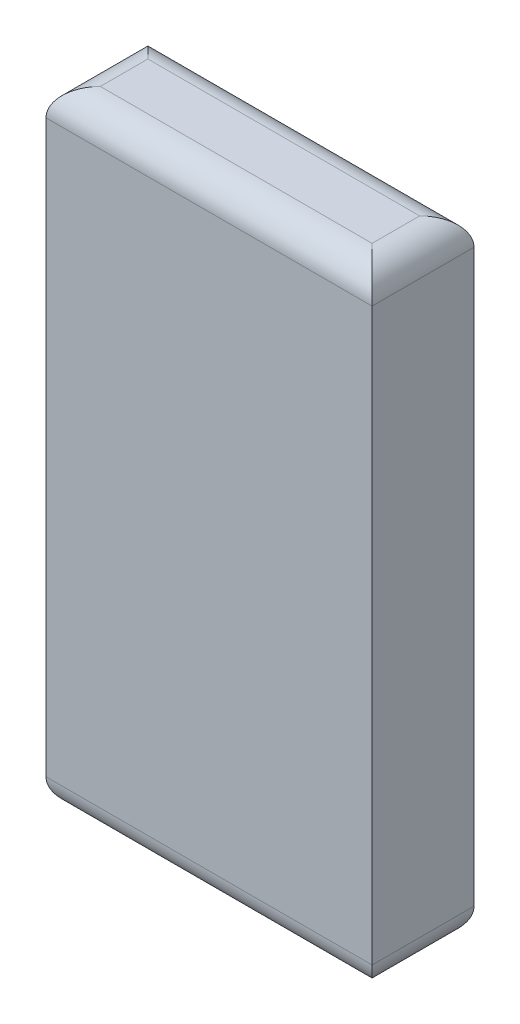
ISO-10303-21;
HEADER;
FILE_DESCRIPTION(('STEP AP214'),'2;1');
FILE_NAME('part.step','',(''),(''),'','','');
FILE_SCHEMA(('AUTOMOTIVE_DESIGN { 1 0 10303 214 1 1 1 1 }'));
ENDSEC;
DATA;
#1=APPLICATION_CONTEXT('core data for automotive mechanical design processes');
#2=APPLICATION_PROTOCOL_DEFINITION('international standard','automotive_design',2000,#1);
#3=PRODUCT_CONTEXT('',#1,'mechanical');
#4=PRODUCT('Part','Part','',(#3));
#5=PRODUCT_RELATED_PRODUCT_CATEGORY('part','',(#4));
#6=PRODUCT_DEFINITION_FORMATION('','',#4);
#7=PRODUCT_DEFINITION_CONTEXT('part definition',#1,'design');
#8=PRODUCT_DEFINITION('design','',#6,#7);
#9=PRODUCT_DEFINITION_SHAPE('','',#8);
#10=(LENGTH_UNIT() NAMED_UNIT(*) SI_UNIT(.MILLI.,.METRE.));
#11=(NAMED_UNIT(*) PLANE_ANGLE_UNIT() SI_UNIT($,.RADIAN.));
#12=(NAMED_UNIT(*) SI_UNIT($,.STERADIAN.) SOLID_ANGLE_UNIT());
#13=UNCERTAINTY_MEASURE_WITH_UNIT(LENGTH_MEASURE(1.E-05),#10,'distance_accuracy_value','');
#14=(GEOMETRIC_REPRESENTATION_CONTEXT(3) GLOBAL_UNCERTAINTY_ASSIGNED_CONTEXT((#13)) GLOBAL_UNIT_ASSIGNED_CONTEXT((#10,
#11,#12)) REPRESENTATION_CONTEXT('',''));
#15=CARTESIAN_POINT('',(0.,0.,0.));
#16=DIRECTION('',(0.,0.,1.));
#17=DIRECTION('',(1.,0.,0.));
#18=AXIS2_PLACEMENT_3D('',#15,#16,#17);
#19=CARTESIAN_POINT('',(0.,0.,9.525));
#20=DIRECTION('',(1.,0.,0.));
#21=DIRECTION('',(0.,0.,-1.));
#22=AXIS2_PLACEMENT_3D('',#19,#20,#21);
#23=PLANE('',#22);
#24=DIRECTION('',(0.,-1.,0.));
#25=VECTOR('',#24,1.);
#26=CARTESIAN_POINT('',(0.,0.,0.));
#27=LINE('',#26,#25);
#28=CARTESIAN_POINT('',(0.,55.88,0.));
#29=VERTEX_POINT('',#28);
#30=CARTESIAN_POINT('',(0.,2.54,0.));
#31=VERTEX_POINT('',#30);
#32=EDGE_CURVE('E184',#29,#31,#27,.T.);
#33=ORIENTED_EDGE('',*,*,#32,.T.);
#34=DIRECTION('',(0.,0.,-1.));
#35=VECTOR('',#34,1.);
#36=CARTESIAN_POINT('',(0.,2.54,9.525));
#37=LINE('',#36,#35);
#38=CARTESIAN_POINT('',(0.,2.54,9.525));
#39=VERTEX_POINT('',#38);
#40=EDGE_CURVE('E118',#31,#39,#37,.F.);
#41=ORIENTED_EDGE('',*,*,#40,.T.);
#42=DIRECTION('',(0.,-1.,0.));
#43=VECTOR('',#42,1.);
#44=CARTESIAN_POINT('',(0.,0.,9.525));
#45=LINE('',#44,#43);
#46=CARTESIAN_POINT('',(0.,55.88,9.525));
#47=VERTEX_POINT('',#46);
#48=EDGE_CURVE('E209',#47,#39,#45,.T.);
#49=ORIENTED_EDGE('',*,*,#48,.F.);
#50=DIRECTION('',(0.,0.,-1.));
#51=VECTOR('',#50,1.);
#52=CARTESIAN_POINT('',(0.,55.88,9.525));
#53=LINE('',#52,#51);
#54=EDGE_CURVE('E140',#47,#29,#53,.T.);
#55=ORIENTED_EDGE('',*,*,#54,.T.);
#56=EDGE_LOOP('',(#33,#41,#49,#55));
#57=FACE_BOUND('',#56,.T.);
#58=ADVANCED_FACE('F45',(#57),#23,.F.);
#59=CARTESIAN_POINT('',(0.,0.,9.525));
#60=DIRECTION('',(0.,1.,0.));
#61=DIRECTION('',(0.,0.,1.));
#62=AXIS2_PLACEMENT_3D('',#59,#60,#61);
#63=PLANE('',#62);
#64=DIRECTION('',(1.,0.,0.));
#65=VECTOR('',#64,1.);
#66=CARTESIAN_POINT('',(0.,0.,6.985));
#67=LINE('',#66,#65);
#68=CARTESIAN_POINT('',(27.94,0.,6.985));
#69=VERTEX_POINT('',#68);
#70=CARTESIAN_POINT('',(2.54,0.,6.985));
#71=VERTEX_POINT('',#70);
#72=EDGE_CURVE('E137',#69,#71,#67,.F.);
#73=ORIENTED_EDGE('',*,*,#72,.T.);
#74=DIRECTION('',(0.,0.,-1.));
#75=VECTOR('',#74,1.);
#76=CARTESIAN_POINT('',(2.54,0.,9.525));
#77=LINE('',#76,#75);
#78=CARTESIAN_POINT('',(2.54,0.,2.54));
#79=VERTEX_POINT('',#78);
#80=EDGE_CURVE('E116',#71,#79,#77,.T.);
#81=ORIENTED_EDGE('',*,*,#80,.T.);
#82=DIRECTION('',(1.,0.,0.));
#83=VECTOR('',#82,1.);
#84=CARTESIAN_POINT('',(30.48,0.,2.54));
#85=LINE('',#84,#83);
#86=CARTESIAN_POINT('',(27.94,0.,2.54));
#87=VERTEX_POINT('',#86);
#88=EDGE_CURVE('E125',#79,#87,#85,.T.);
#89=ORIENTED_EDGE('',*,*,#88,.T.);
#90=DIRECTION('',(0.,0.,-1.));
#91=VECTOR('',#90,1.);
#92=CARTESIAN_POINT('',(27.94,0.,9.525));
#93=LINE('',#92,#91);
#94=EDGE_CURVE('E132',#87,#69,#93,.F.);
#95=ORIENTED_EDGE('',*,*,#94,.T.);
#96=EDGE_LOOP('',(#73,#81,#89,#95));
#97=FACE_BOUND('',#96,.T.);
#98=ADVANCED_FACE('F135',(#97),#63,.F.);
#99=CARTESIAN_POINT('',(30.48,0.,9.525));
#100=DIRECTION('',(-1.,0.,0.));
#101=DIRECTION('',(0.,0.,1.));
#102=AXIS2_PLACEMENT_3D('',#99,#100,#101);
#103=PLANE('',#102);
#104=DIRECTION('',(0.,1.,0.));
#105=VECTOR('',#104,1.);
#106=CARTESIAN_POINT('',(30.48,0.,9.525));
#107=LINE('',#106,#105);
#108=CARTESIAN_POINT('',(30.48,2.54,9.525));
#109=VERTEX_POINT('',#108);
#110=CARTESIAN_POINT('',(30.48,55.88,9.525));
#111=VERTEX_POINT('',#110);
#112=EDGE_CURVE('E133',#109,#111,#107,.T.);
#113=ORIENTED_EDGE('',*,*,#112,.F.);
#114=DIRECTION('',(0.,0.,-1.));
#115=VECTOR('',#114,1.);
#116=CARTESIAN_POINT('',(30.48,2.54,9.525));
#117=LINE('',#116,#115);
#118=CARTESIAN_POINT('',(30.48,2.54,0.));
#119=VERTEX_POINT('',#118);
#120=EDGE_CURVE('E160',#109,#119,#117,.T.);
#121=ORIENTED_EDGE('',*,*,#120,.T.);
#122=DIRECTION('',(0.,1.,0.));
#123=VECTOR('',#122,1.);
#124=CARTESIAN_POINT('',(30.48,0.,0.));
#125=LINE('',#124,#123);
#126=CARTESIAN_POINT('',(30.48,55.88,0.));
#127=VERTEX_POINT('',#126);
#128=EDGE_CURVE('E215',#119,#127,#125,.T.);
#129=ORIENTED_EDGE('',*,*,#128,.T.);
#130=DIRECTION('',(0.,0.,-1.));
#131=VECTOR('',#130,1.);
#132=CARTESIAN_POINT('',(30.48,55.88,9.525));
#133=LINE('',#132,#131);
#134=EDGE_CURVE('E156',#127,#111,#133,.F.);
#135=ORIENTED_EDGE('',*,*,#134,.T.);
#136=EDGE_LOOP('',(#113,#121,#129,#135));
#137=FACE_BOUND('',#136,.T.);
#138=ADVANCED_FACE('F236',(#137),#103,.F.);
#139=CARTESIAN_POINT('',(0.,58.42,9.525));
#140=DIRECTION('',(0.,-1.,0.));
#141=DIRECTION('',(0.,0.,-1.));
#142=AXIS2_PLACEMENT_3D('',#139,#140,#141);
#143=PLANE('',#142);
#144=DIRECTION('',(-1.,0.,0.));
#145=VECTOR('',#144,1.);
#146=CARTESIAN_POINT('',(0.,58.42,6.985));
#147=LINE('',#146,#145);
#148=CARTESIAN_POINT('',(2.54,58.42,6.985));
#149=VERTEX_POINT('',#148);
#150=CARTESIAN_POINT('',(27.94,58.42,6.985));
#151=VERTEX_POINT('',#150);
#152=EDGE_CURVE('E55',#149,#151,#147,.F.);
#153=ORIENTED_EDGE('',*,*,#152,.T.);
#154=DIRECTION('',(0.,0.,-1.));
#155=VECTOR('',#154,1.);
#156=CARTESIAN_POINT('',(27.94,58.42,9.525));
#157=LINE('',#156,#155);
#158=CARTESIAN_POINT('',(27.94,58.42,2.54));
#159=VERTEX_POINT('',#158);
#160=EDGE_CURVE('E11',#151,#159,#157,.T.);
#161=ORIENTED_EDGE('',*,*,#160,.T.);
#162=DIRECTION('',(-1.,0.,0.));
#163=VECTOR('',#162,1.);
#164=CARTESIAN_POINT('',(0.,58.42,2.54));
#165=LINE('',#164,#163);
#166=CARTESIAN_POINT('',(2.54,58.42,2.54));
#167=VERTEX_POINT('',#166);
#168=EDGE_CURVE('E169',#159,#167,#165,.T.);
#169=ORIENTED_EDGE('',*,*,#168,.T.);
#170=DIRECTION('',(0.,0.,-1.));
#171=VECTOR('',#170,1.);
#172=CARTESIAN_POINT('',(2.54,58.42,9.525));
#173=LINE('',#172,#171);
#174=EDGE_CURVE('E66',#167,#149,#173,.F.);
#175=ORIENTED_EDGE('',*,*,#174,.T.);
#176=EDGE_LOOP('',(#153,#161,#169,#175));
#177=FACE_BOUND('',#176,.T.);
#178=ADVANCED_FACE('F243',(#177),#143,.F.);
#179=CARTESIAN_POINT('',(0.,0.,9.525));
#180=DIRECTION('',(0.,0.,-1.));
#181=DIRECTION('',(-1.,0.,0.));
#182=AXIS2_PLACEMENT_3D('',#179,#180,#181);
#183=PLANE('',#182);
#184=ORIENTED_EDGE('',*,*,#48,.T.);
#185=DIRECTION('',(1.,0.,0.));
#186=VECTOR('',#185,1.);
#187=CARTESIAN_POINT('',(0.,2.54,9.525));
#188=LINE('',#187,#186);
#189=EDGE_CURVE('E153',#39,#109,#188,.T.);
#190=ORIENTED_EDGE('',*,*,#189,.T.);
#191=ORIENTED_EDGE('',*,*,#112,.T.);
#192=DIRECTION('',(-1.,0.,0.));
#193=VECTOR('',#192,1.);
#194=CARTESIAN_POINT('',(0.,55.88,9.525));
#195=LINE('',#194,#193);
#196=EDGE_CURVE('E150',#111,#47,#195,.T.);
#197=ORIENTED_EDGE('',*,*,#196,.T.);
#198=EDGE_LOOP('',(#184,#190,#191,#197));
#199=FACE_BOUND('',#198,.T.);
#200=ADVANCED_FACE('F232',(#199),#183,.F.);
#201=CARTESIAN_POINT('',(0.,0.,0.));
#202=DIRECTION('',(0.,0.,-1.));
#203=DIRECTION('',(-1.,0.,0.));
#204=AXIS2_PLACEMENT_3D('',#201,#202,#203);
#205=PLANE('',#204);
#206=ORIENTED_EDGE('',*,*,#128,.F.);
#207=DIRECTION('',(1.,0.,0.));
#208=VECTOR('',#207,1.);
#209=CARTESIAN_POINT('',(0.,2.54,0.));
#210=LINE('',#209,#208);
#211=EDGE_CURVE('E166',#119,#31,#210,.F.);
#212=ORIENTED_EDGE('',*,*,#211,.T.);
#213=ORIENTED_EDGE('',*,*,#32,.F.);
#214=DIRECTION('',(-1.,0.,0.));
#215=VECTOR('',#214,1.);
#216=CARTESIAN_POINT('',(30.48,55.88,0.));
#217=LINE('',#216,#215);
#218=EDGE_CURVE('E163',#29,#127,#217,.F.);
#219=ORIENTED_EDGE('',*,*,#218,.T.);
#220=EDGE_LOOP('',(#206,#212,#213,#219));
#221=FACE_BOUND('',#220,.T.);
#222=ADVANCED_FACE('F212',(#221),#205,.T.);
#223=CARTESIAN_POINT('',(27.94,2.54,9.525));
#224=DIRECTION('',(0.,0.,-1.));
#225=DIRECTION('',(-1.,0.,0.));
#226=AXIS2_PLACEMENT_3D('',#223,#224,#225);
#227=CYLINDRICAL_SURFACE('',#226,2.54);
#228=CARTESIAN_POINT('',(27.94,2.54,2.54));
#229=DIRECTION('',(-0.707106781186547,0.,-0.707106781186547));
#230=DIRECTION('',(-0.707106781186547,0.,0.707106781186547));
#231=AXIS2_PLACEMENT_3D('',#228,#229,#230);
#232=ELLIPSE('',#231,3.59210244842766,2.54);
#233=EDGE_CURVE('E128',#119,#87,#232,.T.);
#234=ORIENTED_EDGE('',*,*,#233,.F.);
#235=ORIENTED_EDGE('',*,*,#120,.F.);
#236=CARTESIAN_POINT('',(27.94,2.54,6.985));
#237=DIRECTION('',(0.707106781186547,0.,-0.707106781186547));
#238=DIRECTION('',(-0.707106781186547,0.,-0.707106781186547));
#239=AXIS2_PLACEMENT_3D('',#236,#237,#238);
#240=ELLIPSE('',#239,3.59210244842766,2.54);
#241=EDGE_CURVE('E180',#69,#109,#240,.F.);
#242=ORIENTED_EDGE('',*,*,#241,.F.);
#243=ORIENTED_EDGE('',*,*,#94,.F.);
#244=EDGE_LOOP('',(#234,#235,#242,#243));
#245=FACE_BOUND('',#244,.T.);
#246=ADVANCED_FACE('F225',(#245),#227,.T.);
#247=CARTESIAN_POINT('',(0.,2.54,6.985));
#248=DIRECTION('',(1.,0.,0.));
#249=DIRECTION('',(0.,0.,-1.));
#250=AXIS2_PLACEMENT_3D('',#247,#248,#249);
#251=CYLINDRICAL_SURFACE('',#250,2.54);
#252=ORIENTED_EDGE('',*,*,#241,.T.);
#253=ORIENTED_EDGE('',*,*,#189,.F.);
#254=CARTESIAN_POINT('',(2.54,2.54,6.985));
#255=DIRECTION('',(0.707106781186547,0.,0.707106781186547));
#256=DIRECTION('',(0.707106781186547,0.,-0.707106781186547));
#257=AXIS2_PLACEMENT_3D('',#254,#255,#256);
#258=ELLIPSE('',#257,3.59210244842766,2.54);
#259=EDGE_CURVE('E122',#71,#39,#258,.F.);
#260=ORIENTED_EDGE('',*,*,#259,.F.);
#261=ORIENTED_EDGE('',*,*,#72,.F.);
#262=EDGE_LOOP('',(#252,#253,#260,#261));
#263=FACE_BOUND('',#262,.T.);
#264=ADVANCED_FACE('F228',(#263),#251,.T.);
#265=CARTESIAN_POINT('',(0.,2.54,2.54));
#266=DIRECTION('',(-1.,0.,0.));
#267=DIRECTION('',(0.,0.,1.));
#268=AXIS2_PLACEMENT_3D('',#265,#266,#267);
#269=CYLINDRICAL_SURFACE('',#268,2.54);
#270=ORIENTED_EDGE('',*,*,#233,.T.);
#271=ORIENTED_EDGE('',*,*,#88,.F.);
#272=CARTESIAN_POINT('',(2.54,2.54,2.54));
#273=DIRECTION('',(-0.707106781186547,0.,0.707106781186547));
#274=DIRECTION('',(-0.707106781186547,0.,-0.707106781186547));
#275=AXIS2_PLACEMENT_3D('',#272,#273,#274);
#276=ELLIPSE('',#275,3.59210244842766,2.54);
#277=EDGE_CURVE('E112',#31,#79,#276,.T.);
#278=ORIENTED_EDGE('',*,*,#277,.F.);
#279=ORIENTED_EDGE('',*,*,#211,.F.);
#280=EDGE_LOOP('',(#270,#271,#278,#279));
#281=FACE_BOUND('',#280,.T.);
#282=ADVANCED_FACE('F126',(#281),#269,.T.);
#283=CARTESIAN_POINT('',(2.54,2.54,9.525));
#284=DIRECTION('',(0.,0.,-1.));
#285=DIRECTION('',(-1.,0.,0.));
#286=AXIS2_PLACEMENT_3D('',#283,#284,#285);
#287=CYLINDRICAL_SURFACE('',#286,2.54);
#288=ORIENTED_EDGE('',*,*,#259,.T.);
#289=ORIENTED_EDGE('',*,*,#40,.F.);
#290=ORIENTED_EDGE('',*,*,#277,.T.);
#291=ORIENTED_EDGE('',*,*,#80,.F.);
#292=EDGE_LOOP('',(#288,#289,#290,#291));
#293=FACE_BOUND('',#292,.T.);
#294=ADVANCED_FACE('F114',(#293),#287,.T.);
#295=CARTESIAN_POINT('',(2.54,55.88,9.525));
#296=DIRECTION('',(0.,0.,-1.));
#297=DIRECTION('',(-1.,0.,0.));
#298=AXIS2_PLACEMENT_3D('',#295,#296,#297);
#299=CYLINDRICAL_SURFACE('',#298,2.54);
#300=CARTESIAN_POINT('',(2.54,55.88,2.54));
#301=DIRECTION('',(0.707106781186547,0.,-0.707106781186547));
#302=DIRECTION('',(0.707106781186547,0.,0.707106781186547));
#303=AXIS2_PLACEMENT_3D('',#300,#301,#302);
#304=ELLIPSE('',#303,3.59210244842766,2.54);
#305=EDGE_CURVE('E190',#29,#167,#304,.T.);
#306=ORIENTED_EDGE('',*,*,#305,.F.);
#307=ORIENTED_EDGE('',*,*,#54,.F.);
#308=CARTESIAN_POINT('',(2.54,55.88,6.985));
#309=DIRECTION('',(-0.707106781186547,0.,-0.707106781186547));
#310=DIRECTION('',(0.707106781186547,0.,-0.707106781186547));
#311=AXIS2_PLACEMENT_3D('',#308,#309,#310);
#312=ELLIPSE('',#311,3.59210244842766,2.54);
#313=EDGE_CURVE('E49',#149,#47,#312,.F.);
#314=ORIENTED_EDGE('',*,*,#313,.F.);
#315=ORIENTED_EDGE('',*,*,#174,.F.);
#316=EDGE_LOOP('',(#306,#307,#314,#315));
#317=FACE_BOUND('',#316,.T.);
#318=ADVANCED_FACE('F47',(#317),#299,.T.);
#319=CARTESIAN_POINT('',(0.,55.88,6.985));
#320=DIRECTION('',(-1.,0.,0.));
#321=DIRECTION('',(0.,0.,1.));
#322=AXIS2_PLACEMENT_3D('',#319,#320,#321);
#323=CYLINDRICAL_SURFACE('',#322,2.54);
#324=ORIENTED_EDGE('',*,*,#313,.T.);
#325=ORIENTED_EDGE('',*,*,#196,.F.);
#326=CARTESIAN_POINT('',(27.94,55.88,6.985));
#327=DIRECTION('',(-0.707106781186547,0.,0.707106781186547));
#328=DIRECTION('',(-0.707106781186547,0.,-0.707106781186547));
#329=AXIS2_PLACEMENT_3D('',#326,#327,#328);
#330=ELLIPSE('',#329,3.59210244842766,2.54);
#331=EDGE_CURVE('E188',#151,#111,#330,.F.);
#332=ORIENTED_EDGE('',*,*,#331,.F.);
#333=ORIENTED_EDGE('',*,*,#152,.F.);
#334=EDGE_LOOP('',(#324,#325,#332,#333));
#335=FACE_BOUND('',#334,.T.);
#336=ADVANCED_FACE('F201',(#335),#323,.T.);
#337=CARTESIAN_POINT('',(0.,55.88,2.54));
#338=DIRECTION('',(1.,0.,0.));
#339=DIRECTION('',(0.,0.,-1.));
#340=AXIS2_PLACEMENT_3D('',#337,#338,#339);
#341=CYLINDRICAL_SURFACE('',#340,2.54);
#342=ORIENTED_EDGE('',*,*,#305,.T.);
#343=ORIENTED_EDGE('',*,*,#168,.F.);
#344=CARTESIAN_POINT('',(27.94,55.88,2.54));
#345=DIRECTION('',(0.707106781186547,0.,0.707106781186547));
#346=DIRECTION('',(0.707106781186547,0.,-0.707106781186547));
#347=AXIS2_PLACEMENT_3D('',#344,#345,#346);
#348=ELLIPSE('',#347,3.59210244842766,2.54);
#349=EDGE_CURVE('E185',#127,#159,#348,.T.);
#350=ORIENTED_EDGE('',*,*,#349,.F.);
#351=ORIENTED_EDGE('',*,*,#218,.F.);
#352=EDGE_LOOP('',(#342,#343,#350,#351));
#353=FACE_BOUND('',#352,.T.);
#354=ADVANCED_FACE('F242',(#353),#341,.T.);
#355=CARTESIAN_POINT('',(27.94,55.88,9.525));
#356=DIRECTION('',(0.,0.,-1.));
#357=DIRECTION('',(-1.,0.,0.));
#358=AXIS2_PLACEMENT_3D('',#355,#356,#357);
#359=CYLINDRICAL_SURFACE('',#358,2.54);
#360=ORIENTED_EDGE('',*,*,#331,.T.);
#361=ORIENTED_EDGE('',*,*,#134,.F.);
#362=ORIENTED_EDGE('',*,*,#349,.T.);
#363=ORIENTED_EDGE('',*,*,#160,.F.);
#364=EDGE_LOOP('',(#360,#361,#362,#363));
#365=FACE_BOUND('',#364,.T.);
#366=ADVANCED_FACE('F240',(#365),#359,.T.);
#367=CLOSED_SHELL('',(#58,#98,#138,#178,#200,#222,#246,#264,#282,#294,#318,#336,#354,#366));
#368=MANIFOLD_SOLID_BREP('B2',#367);
#369=ADVANCED_BREP_SHAPE_REPRESENTATION('',(#18,#368),#14);
#370=SHAPE_DEFINITION_REPRESENTATION(#9,#369);
ENDSEC;
END-ISO-10303-21;
